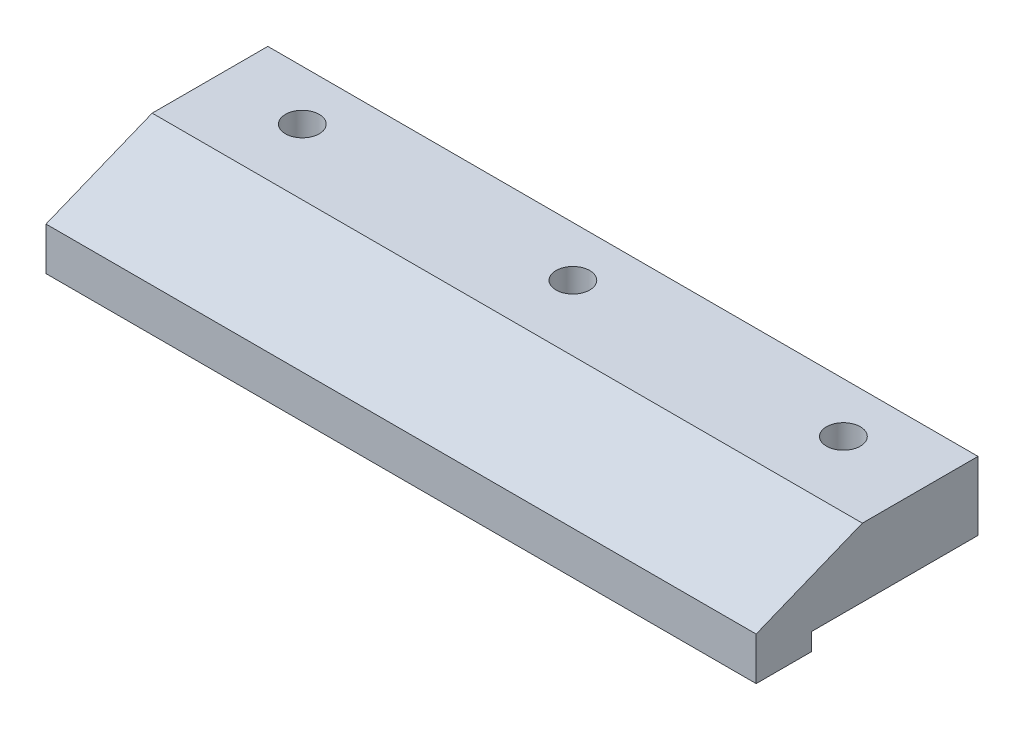
ISO-10303-21;
HEADER;
FILE_DESCRIPTION(('STEP AP214'),'2;1');
FILE_NAME('part.step','',(''),(''),'','','');
FILE_SCHEMA(('AUTOMOTIVE_DESIGN { 1 0 10303 214 1 1 1 1 }'));
ENDSEC;
DATA;
#1=APPLICATION_CONTEXT('core data for automotive mechanical design processes');
#2=APPLICATION_PROTOCOL_DEFINITION('international standard','automotive_design',2000,#1);
#3=PRODUCT_CONTEXT('',#1,'mechanical');
#4=PRODUCT('Part','Part','',(#3));
#5=PRODUCT_RELATED_PRODUCT_CATEGORY('part','',(#4));
#6=PRODUCT_DEFINITION_FORMATION('','',#4);
#7=PRODUCT_DEFINITION_CONTEXT('part definition',#1,'design');
#8=PRODUCT_DEFINITION('design','',#6,#7);
#9=PRODUCT_DEFINITION_SHAPE('','',#8);
#10=(LENGTH_UNIT() NAMED_UNIT(*) SI_UNIT(.MILLI.,.METRE.));
#11=(NAMED_UNIT(*) PLANE_ANGLE_UNIT() SI_UNIT($,.RADIAN.));
#12=(NAMED_UNIT(*) SI_UNIT($,.STERADIAN.) SOLID_ANGLE_UNIT());
#13=UNCERTAINTY_MEASURE_WITH_UNIT(LENGTH_MEASURE(1.E-05),#10,'distance_accuracy_value','');
#14=(GEOMETRIC_REPRESENTATION_CONTEXT(3) GLOBAL_UNCERTAINTY_ASSIGNED_CONTEXT((#13)) GLOBAL_UNIT_ASSIGNED_CONTEXT((#10,
#11,#12)) REPRESENTATION_CONTEXT('',''));
#15=CARTESIAN_POINT('',(0.,0.,0.));
#16=DIRECTION('',(0.,0.,1.));
#17=DIRECTION('',(1.,0.,0.));
#18=AXIS2_PLACEMENT_3D('',#15,#16,#17);
#19=CARTESIAN_POINT('',(-52.5,12.7,25.4));
#20=DIRECTION('',(1.,0.,0.));
#21=DIRECTION('',(0.,0.,-1.));
#22=AXIS2_PLACEMENT_3D('',#19,#20,#21);
#23=PLANE('',#22);
#24=DIRECTION('',(0.,1.,0.));
#25=VECTOR('',#24,1.);
#26=CARTESIAN_POINT('',(-52.5,0.,17.2501978108793));
#27=LINE('',#26,#25);
#28=CARTESIAN_POINT('',(-52.5,0.,17.2501978108793));
#29=VERTEX_POINT('',#28);
#30=CARTESIAN_POINT('',(-52.5,2.57541683892863,17.2501978108793));
#31=VERTEX_POINT('',#30);
#32=EDGE_CURVE('E121',#29,#31,#27,.T.);
#33=ORIENTED_EDGE('',*,*,#32,.F.);
#34=DIRECTION('',(0.,0.,1.));
#35=VECTOR('',#34,1.);
#36=CARTESIAN_POINT('',(-52.5,0.,25.4));
#37=LINE('',#36,#35);
#38=CARTESIAN_POINT('',(-52.5,0.,25.4));
#39=VERTEX_POINT('',#38);
#40=EDGE_CURVE('E133',#29,#39,#37,.T.);
#41=ORIENTED_EDGE('',*,*,#40,.T.);
#42=DIRECTION('',(0.,-1.,0.));
#43=VECTOR('',#42,1.);
#44=CARTESIAN_POINT('',(-52.5,12.7,25.4));
#45=LINE('',#44,#43);
#46=CARTESIAN_POINT('',(-52.5,6.35,25.4));
#47=VERTEX_POINT('',#46);
#48=EDGE_CURVE('E12',#47,#39,#45,.T.);
#49=ORIENTED_EDGE('',*,*,#48,.F.);
#50=DIRECTION('',(0.,0.374972320189401,-0.927036007440799));
#51=VECTOR('',#50,1.);
#52=CARTESIAN_POINT('',(-52.5,14.2865292725063,5.77868926963724));
#53=LINE('',#52,#51);
#54=CARTESIAN_POINT('',(-52.5,12.7,9.70103148873579));
#55=VERTEX_POINT('',#54);
#56=EDGE_CURVE('E188',#47,#55,#53,.T.);
#57=ORIENTED_EDGE('',*,*,#56,.T.);
#58=DIRECTION('',(0.,0.,1.));
#59=VECTOR('',#58,1.);
#60=CARTESIAN_POINT('',(-52.5,12.7,25.4));
#61=LINE('',#60,#59);
#62=CARTESIAN_POINT('',(-52.5,12.7,-7.40000000000001));
#63=VERTEX_POINT('',#62);
#64=EDGE_CURVE('E154',#63,#55,#61,.T.);
#65=ORIENTED_EDGE('',*,*,#64,.F.);
#66=DIRECTION('',(0.,-1.,0.));
#67=VECTOR('',#66,1.);
#68=CARTESIAN_POINT('',(-52.5,0.,-7.40000000000001));
#69=LINE('',#68,#67);
#70=CARTESIAN_POINT('',(-52.5,2.57541683892864,-7.40000000000001));
#71=VERTEX_POINT('',#70);
#72=EDGE_CURVE('E136',#63,#71,#69,.T.);
#73=ORIENTED_EDGE('',*,*,#72,.T.);
#74=DIRECTION('',(0.,0.,1.));
#75=VECTOR('',#74,1.);
#76=CARTESIAN_POINT('',(-52.5,2.57541683892864,0.));
#77=LINE('',#76,#75);
#78=EDGE_CURVE('E128',#71,#31,#77,.T.);
#79=ORIENTED_EDGE('',*,*,#78,.T.);
#80=EDGE_LOOP('',(#33,#41,#49,#57,#65,#73,#79));
#81=FACE_BOUND('',#80,.T.);
#82=ADVANCED_FACE('F60',(#81),#23,.F.);
#83=CARTESIAN_POINT('',(52.5,12.7,25.4));
#84=DIRECTION('',(-1.,0.,0.));
#85=DIRECTION('',(0.,0.,1.));
#86=AXIS2_PLACEMENT_3D('',#83,#84,#85);
#87=PLANE('',#86);
#88=DIRECTION('',(0.,1.,0.));
#89=VECTOR('',#88,1.);
#90=CARTESIAN_POINT('',(52.5,0.,17.2501978108793));
#91=LINE('',#90,#89);
#92=CARTESIAN_POINT('',(52.5,0.,17.2501978108793));
#93=VERTEX_POINT('',#92);
#94=CARTESIAN_POINT('',(52.5,2.57541683892863,17.2501978108793));
#95=VERTEX_POINT('',#94);
#96=EDGE_CURVE('E76',#93,#95,#91,.T.);
#97=ORIENTED_EDGE('',*,*,#96,.T.);
#98=DIRECTION('',(0.,0.,1.));
#99=VECTOR('',#98,1.);
#100=CARTESIAN_POINT('',(52.5,2.57541683892864,0.));
#101=LINE('',#100,#99);
#102=CARTESIAN_POINT('',(52.5,2.57541683892864,-7.40000000000001));
#103=VERTEX_POINT('',#102);
#104=EDGE_CURVE('E137',#103,#95,#101,.T.);
#105=ORIENTED_EDGE('',*,*,#104,.F.);
#106=DIRECTION('',(0.,-1.,0.));
#107=VECTOR('',#106,1.);
#108=CARTESIAN_POINT('',(52.5,0.,-7.40000000000001));
#109=LINE('',#108,#107);
#110=CARTESIAN_POINT('',(52.5,12.7,-7.40000000000001));
#111=VERTEX_POINT('',#110);
#112=EDGE_CURVE('E178',#111,#103,#109,.T.);
#113=ORIENTED_EDGE('',*,*,#112,.F.);
#114=DIRECTION('',(0.,0.,-1.));
#115=VECTOR('',#114,1.);
#116=CARTESIAN_POINT('',(52.5,12.7,25.4));
#117=LINE('',#116,#115);
#118=CARTESIAN_POINT('',(52.5,12.7,9.70103148873579));
#119=VERTEX_POINT('',#118);
#120=EDGE_CURVE('E150',#119,#111,#117,.T.);
#121=ORIENTED_EDGE('',*,*,#120,.F.);
#122=DIRECTION('',(0.,0.374972320189401,-0.927036007440799));
#123=VECTOR('',#122,1.);
#124=CARTESIAN_POINT('',(52.5,14.2865292725063,5.77868926963724));
#125=LINE('',#124,#123);
#126=CARTESIAN_POINT('',(52.5,6.35,25.4));
#127=VERTEX_POINT('',#126);
#128=EDGE_CURVE('E84',#127,#119,#125,.T.);
#129=ORIENTED_EDGE('',*,*,#128,.F.);
#130=DIRECTION('',(0.,-1.,0.));
#131=VECTOR('',#130,1.);
#132=CARTESIAN_POINT('',(52.5,12.7,25.4));
#133=LINE('',#132,#131);
#134=CARTESIAN_POINT('',(52.5,0.,25.4));
#135=VERTEX_POINT('',#134);
#136=EDGE_CURVE('E68',#127,#135,#133,.T.);
#137=ORIENTED_EDGE('',*,*,#136,.T.);
#138=DIRECTION('',(0.,0.,-1.));
#139=VECTOR('',#138,1.);
#140=CARTESIAN_POINT('',(52.5,0.,25.4));
#141=LINE('',#140,#139);
#142=EDGE_CURVE('E145',#135,#93,#141,.T.);
#143=ORIENTED_EDGE('',*,*,#142,.T.);
#144=EDGE_LOOP('',(#97,#105,#113,#121,#129,#137,#143));
#145=FACE_BOUND('',#144,.T.);
#146=ADVANCED_FACE('F200',(#145),#87,.F.);
#147=CARTESIAN_POINT('',(0.,0.,0.));
#148=DIRECTION('',(0.,1.,0.));
#149=DIRECTION('',(0.,0.,1.));
#150=AXIS2_PLACEMENT_3D('',#147,#148,#149);
#151=PLANE('',#150);
#152=DIRECTION('',(1.,0.,0.));
#153=VECTOR('',#152,1.);
#154=CARTESIAN_POINT('',(-52.5,0.,17.2501978108793));
#155=LINE('',#154,#153);
#156=EDGE_CURVE('E118',#29,#93,#155,.T.);
#157=ORIENTED_EDGE('',*,*,#156,.T.);
#158=ORIENTED_EDGE('',*,*,#142,.F.);
#159=DIRECTION('',(1.,0.,0.));
#160=VECTOR('',#159,1.);
#161=CARTESIAN_POINT('',(52.5,0.,25.4));
#162=LINE('',#161,#160);
#163=EDGE_CURVE('E142',#39,#135,#162,.T.);
#164=ORIENTED_EDGE('',*,*,#163,.F.);
#165=ORIENTED_EDGE('',*,*,#40,.F.);
#166=EDGE_LOOP('',(#157,#158,#164,#165));
#167=FACE_BOUND('',#166,.T.);
#168=ADVANCED_FACE('F140',(#167),#151,.F.);
#169=CARTESIAN_POINT('',(52.5,12.7,25.4));
#170=DIRECTION('',(0.,0.,-1.));
#171=DIRECTION('',(-1.,0.,0.));
#172=AXIS2_PLACEMENT_3D('',#169,#170,#171);
#173=PLANE('',#172);
#174=ORIENTED_EDGE('',*,*,#136,.F.);
#175=DIRECTION('',(1.,0.,0.));
#176=VECTOR('',#175,1.);
#177=CARTESIAN_POINT('',(-52.5,6.35,25.4));
#178=LINE('',#177,#176);
#179=EDGE_CURVE('E147',#47,#127,#178,.T.);
#180=ORIENTED_EDGE('',*,*,#179,.F.);
#181=ORIENTED_EDGE('',*,*,#48,.T.);
#182=ORIENTED_EDGE('',*,*,#163,.T.);
#183=EDGE_LOOP('',(#174,#180,#181,#182));
#184=FACE_BOUND('',#183,.T.);
#185=ADVANCED_FACE('F208',(#184),#173,.F.);
#186=CARTESIAN_POINT('',(0.,12.7,0.));
#187=DIRECTION('',(0.,1.,0.));
#188=DIRECTION('',(0.,0.,1.));
#189=AXIS2_PLACEMENT_3D('',#186,#187,#188);
#190=PLANE('',#189);
#191=CARTESIAN_POINT('',(-40.,12.7,0.));
#192=DIRECTION('',(0.,1.,0.));
#193=DIRECTION('',(0.,0.,1.));
#194=AXIS2_PLACEMENT_3D('',#191,#192,#193);
#195=CIRCLE('',#194,2.5);
#196=CARTESIAN_POINT('',(-40.,12.7,2.5));
#197=VERTEX_POINT('',#196);
#198=EDGE_CURVE('E161',#197,#197,#195,.T.);
#199=ORIENTED_EDGE('',*,*,#198,.F.);
#200=EDGE_LOOP('',(#199));
#201=FACE_BOUND('',#200,.T.);
#202=CARTESIAN_POINT('',(40.,12.7,0.));
#203=DIRECTION('',(0.,1.,0.));
#204=DIRECTION('',(0.,0.,1.));
#205=AXIS2_PLACEMENT_3D('',#202,#203,#204);
#206=CIRCLE('',#205,2.5);
#207=CARTESIAN_POINT('',(40.,12.7,2.5));
#208=VERTEX_POINT('',#207);
#209=EDGE_CURVE('E166',#208,#208,#206,.T.);
#210=ORIENTED_EDGE('',*,*,#209,.F.);
#211=EDGE_LOOP('',(#210));
#212=FACE_BOUND('',#211,.T.);
#213=CARTESIAN_POINT('',(0.,12.7,0.));
#214=DIRECTION('',(0.,1.,0.));
#215=DIRECTION('',(0.,0.,1.));
#216=AXIS2_PLACEMENT_3D('',#213,#214,#215);
#217=CIRCLE('',#216,2.5);
#218=CARTESIAN_POINT('',(0.,12.7,2.5));
#219=VERTEX_POINT('',#218);
#220=EDGE_CURVE('E158',#219,#219,#217,.T.);
#221=ORIENTED_EDGE('',*,*,#220,.F.);
#222=EDGE_LOOP('',(#221));
#223=FACE_BOUND('',#222,.T.);
#224=DIRECTION('',(1.,0.,0.));
#225=VECTOR('',#224,1.);
#226=CARTESIAN_POINT('',(-52.5,12.7,-7.40000000000001));
#227=LINE('',#226,#225);
#228=EDGE_CURVE('E127',#63,#111,#227,.T.);
#229=ORIENTED_EDGE('',*,*,#228,.F.);
#230=ORIENTED_EDGE('',*,*,#64,.T.);
#231=DIRECTION('',(1.,0.,0.));
#232=VECTOR('',#231,1.);
#233=CARTESIAN_POINT('',(-52.5,12.7,9.70103148873579));
#234=LINE('',#233,#232);
#235=EDGE_CURVE('E143',#55,#119,#234,.T.);
#236=ORIENTED_EDGE('',*,*,#235,.T.);
#237=ORIENTED_EDGE('',*,*,#120,.T.);
#238=EDGE_LOOP('',(#229,#230,#236,#237));
#239=FACE_BOUND('',#238,.T.);
#240=ADVANCED_FACE('F197',(#201,#212,#223,#239),#190,.T.);
#241=CARTESIAN_POINT('',(-52.5,14.2865292725063,5.77868926963724));
#242=DIRECTION('',(0.,-0.927036007440799,-0.374972320189401));
#243=DIRECTION('',(0.,0.374972320189401,-0.927036007440799));
#244=AXIS2_PLACEMENT_3D('',#241,#242,#243);
#245=PLANE('',#244);
#246=ORIENTED_EDGE('',*,*,#128,.T.);
#247=ORIENTED_EDGE('',*,*,#235,.F.);
#248=ORIENTED_EDGE('',*,*,#56,.F.);
#249=ORIENTED_EDGE('',*,*,#179,.T.);
#250=EDGE_LOOP('',(#246,#247,#248,#249));
#251=FACE_BOUND('',#250,.T.);
#252=ADVANCED_FACE('F206',(#251),#245,.F.);
#253=CARTESIAN_POINT('',(-52.5,0.,17.2501978108793));
#254=DIRECTION('',(0.,0.,-1.));
#255=DIRECTION('',(-1.,0.,0.));
#256=AXIS2_PLACEMENT_3D('',#253,#254,#255);
#257=PLANE('',#256);
#258=ORIENTED_EDGE('',*,*,#96,.F.);
#259=ORIENTED_EDGE('',*,*,#156,.F.);
#260=ORIENTED_EDGE('',*,*,#32,.T.);
#261=DIRECTION('',(1.,0.,0.));
#262=VECTOR('',#261,1.);
#263=CARTESIAN_POINT('',(-52.5,2.57541683892863,17.2501978108793));
#264=LINE('',#263,#262);
#265=EDGE_CURVE('E183',#31,#95,#264,.T.);
#266=ORIENTED_EDGE('',*,*,#265,.T.);
#267=EDGE_LOOP('',(#258,#259,#260,#266));
#268=FACE_BOUND('',#267,.T.);
#269=ADVANCED_FACE('F120',(#268),#257,.T.);
#270=CARTESIAN_POINT('',(-52.5,2.57541683892864,0.));
#271=DIRECTION('',(0.,1.,0.));
#272=DIRECTION('',(0.,0.,1.));
#273=AXIS2_PLACEMENT_3D('',#270,#271,#272);
#274=PLANE('',#273);
#275=CARTESIAN_POINT('',(-40.,2.57541683892864,0.));
#276=DIRECTION('',(0.,1.,0.));
#277=DIRECTION('',(0.,0.,1.));
#278=AXIS2_PLACEMENT_3D('',#275,#276,#277);
#279=CIRCLE('',#278,2.5);
#280=CARTESIAN_POINT('',(-40.,2.57541683892864,2.5));
#281=VERTEX_POINT('',#280);
#282=EDGE_CURVE('E63',#281,#281,#279,.T.);
#283=ORIENTED_EDGE('',*,*,#282,.T.);
#284=EDGE_LOOP('',(#283));
#285=FACE_BOUND('',#284,.T.);
#286=CARTESIAN_POINT('',(40.,2.57541683892864,0.));
#287=DIRECTION('',(0.,1.,0.));
#288=DIRECTION('',(0.,0.,1.));
#289=AXIS2_PLACEMENT_3D('',#286,#287,#288);
#290=CIRCLE('',#289,2.5);
#291=CARTESIAN_POINT('',(40.,2.57541683892864,2.5));
#292=VERTEX_POINT('',#291);
#293=EDGE_CURVE('E159',#292,#292,#290,.T.);
#294=ORIENTED_EDGE('',*,*,#293,.T.);
#295=EDGE_LOOP('',(#294));
#296=FACE_BOUND('',#295,.T.);
#297=CARTESIAN_POINT('',(0.,2.57541683892864,0.));
#298=DIRECTION('',(0.,1.,0.));
#299=DIRECTION('',(0.,0.,1.));
#300=AXIS2_PLACEMENT_3D('',#297,#298,#299);
#301=CIRCLE('',#300,2.5);
#302=CARTESIAN_POINT('',(0.,2.57541683892864,2.5));
#303=VERTEX_POINT('',#302);
#304=EDGE_CURVE('E156',#303,#303,#301,.T.);
#305=ORIENTED_EDGE('',*,*,#304,.T.);
#306=EDGE_LOOP('',(#305));
#307=FACE_BOUND('',#306,.T.);
#308=ORIENTED_EDGE('',*,*,#104,.T.);
#309=ORIENTED_EDGE('',*,*,#265,.F.);
#310=ORIENTED_EDGE('',*,*,#78,.F.);
#311=DIRECTION('',(1.,0.,0.));
#312=VECTOR('',#311,1.);
#313=CARTESIAN_POINT('',(-52.5,2.57541683892864,-7.40000000000001));
#314=LINE('',#313,#312);
#315=EDGE_CURVE('E185',#71,#103,#314,.T.);
#316=ORIENTED_EDGE('',*,*,#315,.T.);
#317=EDGE_LOOP('',(#308,#309,#310,#316));
#318=FACE_BOUND('',#317,.T.);
#319=ADVANCED_FACE('F229',(#285,#296,#307,#318),#274,.F.);
#320=CARTESIAN_POINT('',(-52.5,0.,-7.40000000000001));
#321=DIRECTION('',(0.,0.,1.));
#322=DIRECTION('',(0.,-1.,0.));
#323=AXIS2_PLACEMENT_3D('',#320,#321,#322);
#324=PLANE('',#323);
#325=ORIENTED_EDGE('',*,*,#112,.T.);
#326=ORIENTED_EDGE('',*,*,#315,.F.);
#327=ORIENTED_EDGE('',*,*,#72,.F.);
#328=ORIENTED_EDGE('',*,*,#228,.T.);
#329=EDGE_LOOP('',(#325,#326,#327,#328));
#330=FACE_BOUND('',#329,.T.);
#331=ADVANCED_FACE('F204',(#330),#324,.F.);
#332=CARTESIAN_POINT('',(0.,0.,0.));
#333=DIRECTION('',(0.,1.,0.));
#334=DIRECTION('',(0.,0.,1.));
#335=AXIS2_PLACEMENT_3D('',#332,#333,#334);
#336=CYLINDRICAL_SURFACE('',#335,2.5);
#337=ORIENTED_EDGE('',*,*,#220,.T.);
#338=EDGE_LOOP('',(#337));
#339=FACE_BOUND('',#338,.T.);
#340=ORIENTED_EDGE('',*,*,#304,.F.);
#341=EDGE_LOOP('',(#340));
#342=FACE_BOUND('',#341,.T.);
#343=ADVANCED_FACE('F232',(#339,#342),#336,.F.);
#344=CARTESIAN_POINT('',(40.,0.,0.));
#345=DIRECTION('',(0.,1.,0.));
#346=DIRECTION('',(0.,0.,1.));
#347=AXIS2_PLACEMENT_3D('',#344,#345,#346);
#348=CYLINDRICAL_SURFACE('',#347,2.5);
#349=ORIENTED_EDGE('',*,*,#209,.T.);
#350=EDGE_LOOP('',(#349));
#351=FACE_BOUND('',#350,.T.);
#352=ORIENTED_EDGE('',*,*,#293,.F.);
#353=EDGE_LOOP('',(#352));
#354=FACE_BOUND('',#353,.T.);
#355=ADVANCED_FACE('F238',(#351,#354),#348,.F.);
#356=CARTESIAN_POINT('',(-40.,0.,0.));
#357=DIRECTION('',(0.,1.,0.));
#358=DIRECTION('',(0.,0.,1.));
#359=AXIS2_PLACEMENT_3D('',#356,#357,#358);
#360=CYLINDRICAL_SURFACE('',#359,2.5);
#361=ORIENTED_EDGE('',*,*,#198,.T.);
#362=EDGE_LOOP('',(#361));
#363=FACE_BOUND('',#362,.T.);
#364=ORIENTED_EDGE('',*,*,#282,.F.);
#365=EDGE_LOOP('',(#364));
#366=FACE_BOUND('',#365,.T.);
#367=ADVANCED_FACE('F242',(#363,#366),#360,.F.);
#368=CLOSED_SHELL('',(#82,#146,#168,#185,#240,#252,#269,#319,#331,#343,#355,#367));
#369=MANIFOLD_SOLID_BREP('B2',#368);
#370=ADVANCED_BREP_SHAPE_REPRESENTATION('',(#18,#369),#14);
#371=SHAPE_DEFINITION_REPRESENTATION(#9,#370);
ENDSEC;
END-ISO-10303-21;
